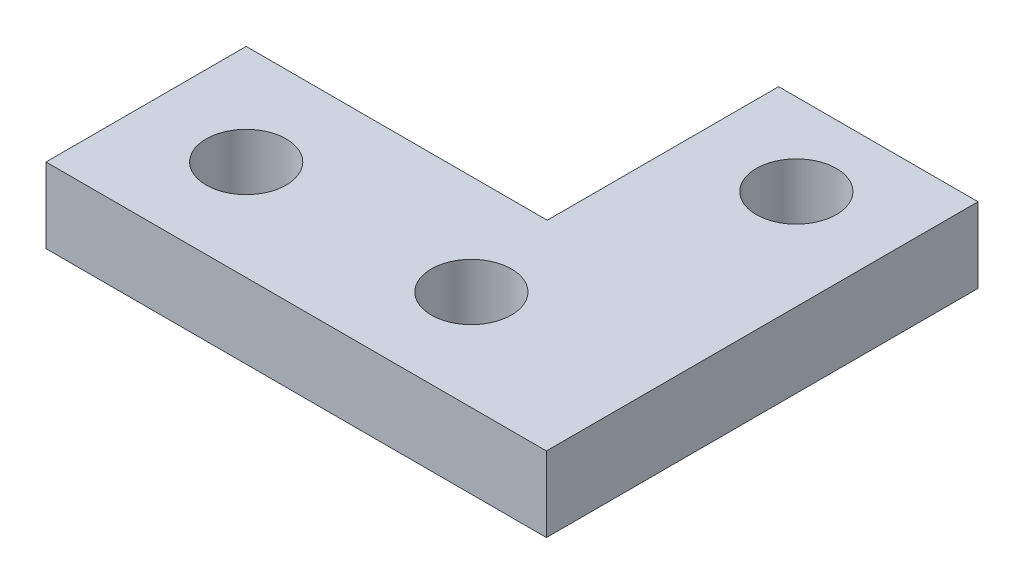
ISO-10303-21;
HEADER;
FILE_DESCRIPTION(('STEP AP214'),'2;1');
FILE_NAME('part.step','',(''),(''),'','','');
FILE_SCHEMA(('AUTOMOTIVE_DESIGN { 1 0 10303 214 1 1 1 1 }'));
ENDSEC;
DATA;
#1=APPLICATION_CONTEXT('core data for automotive mechanical design processes');
#2=APPLICATION_PROTOCOL_DEFINITION('international standard','automotive_design',2000,#1);
#3=PRODUCT_CONTEXT('',#1,'mechanical');
#4=PRODUCT('Part','Part','',(#3));
#5=PRODUCT_RELATED_PRODUCT_CATEGORY('part','',(#4));
#6=PRODUCT_DEFINITION_FORMATION('','',#4);
#7=PRODUCT_DEFINITION_CONTEXT('part definition',#1,'design');
#8=PRODUCT_DEFINITION('design','',#6,#7);
#9=PRODUCT_DEFINITION_SHAPE('','',#8);
#10=(LENGTH_UNIT() NAMED_UNIT(*) SI_UNIT(.MILLI.,.METRE.));
#11=(NAMED_UNIT(*) PLANE_ANGLE_UNIT() SI_UNIT($,.RADIAN.));
#12=(NAMED_UNIT(*) SI_UNIT($,.STERADIAN.) SOLID_ANGLE_UNIT());
#13=UNCERTAINTY_MEASURE_WITH_UNIT(LENGTH_MEASURE(1.E-05),#10,'distance_accuracy_value','');
#14=(GEOMETRIC_REPRESENTATION_CONTEXT(3) GLOBAL_UNCERTAINTY_ASSIGNED_CONTEXT((#13)) GLOBAL_UNIT_ASSIGNED_CONTEXT((#10,
#11,#12)) REPRESENTATION_CONTEXT('',''));
#15=CARTESIAN_POINT('',(0.,0.,0.));
#16=DIRECTION('',(0.,0.,1.));
#17=DIRECTION('',(1.,0.,0.));
#18=AXIS2_PLACEMENT_3D('',#15,#16,#17);
#19=CARTESIAN_POINT('',(0.,3.,0.));
#20=DIRECTION('',(0.,-1.,0.));
#21=DIRECTION('',(0.,0.,-1.));
#22=AXIS2_PLACEMENT_3D('',#19,#20,#21);
#23=PLANE('',#22);
#24=DIRECTION('',(0.,0.,1.));
#25=VECTOR('',#24,1.);
#26=CARTESIAN_POINT('',(0.,3.,0.));
#27=LINE('',#26,#25);
#28=CARTESIAN_POINT('',(0.,3.,-8.));
#29=VERTEX_POINT('',#28);
#30=CARTESIAN_POINT('',(0.,3.,0.));
#31=VERTEX_POINT('',#30);
#32=EDGE_CURVE('E132',#29,#31,#27,.T.);
#33=ORIENTED_EDGE('',*,*,#32,.T.);
#34=DIRECTION('',(1.,0.,0.));
#35=VECTOR('',#34,1.);
#36=CARTESIAN_POINT('',(0.,3.,0.));
#37=LINE('',#36,#35);
#38=CARTESIAN_POINT('',(20.,3.,0.));
#39=VERTEX_POINT('',#38);
#40=EDGE_CURVE('E89',#31,#39,#37,.T.);
#41=ORIENTED_EDGE('',*,*,#40,.T.);
#42=DIRECTION('',(0.,0.,-1.));
#43=VECTOR('',#42,1.);
#44=CARTESIAN_POINT('',(20.,3.,0.));
#45=LINE('',#44,#43);
#46=CARTESIAN_POINT('',(20.,3.,-17.2473887185271));
#47=VERTEX_POINT('',#46);
#48=EDGE_CURVE('E102',#39,#47,#45,.T.);
#49=ORIENTED_EDGE('',*,*,#48,.T.);
#50=DIRECTION('',(-1.,0.,0.));
#51=VECTOR('',#50,1.);
#52=CARTESIAN_POINT('',(12.0321682050819,3.,-17.2473887185271));
#53=LINE('',#52,#51);
#54=CARTESIAN_POINT('',(12.0321682050819,3.,-17.2473887185271));
#55=VERTEX_POINT('',#54);
#56=EDGE_CURVE('E96',#47,#55,#53,.T.);
#57=ORIENTED_EDGE('',*,*,#56,.T.);
#58=DIRECTION('',(0.,0.,1.));
#59=VECTOR('',#58,1.);
#60=CARTESIAN_POINT('',(12.0321682050819,3.,-8.));
#61=LINE('',#60,#59);
#62=CARTESIAN_POINT('',(12.0321682050819,3.,-8.));
#63=VERTEX_POINT('',#62);
#64=EDGE_CURVE('E100',#55,#63,#61,.T.);
#65=ORIENTED_EDGE('',*,*,#64,.T.);
#66=DIRECTION('',(-1.,0.,0.));
#67=VECTOR('',#66,1.);
#68=CARTESIAN_POINT('',(0.,3.,-8.));
#69=LINE('',#68,#67);
#70=EDGE_CURVE('E52',#63,#29,#69,.T.);
#71=ORIENTED_EDGE('',*,*,#70,.T.);
#72=EDGE_LOOP('',(#33,#41,#49,#57,#65,#71));
#73=FACE_BOUND('',#72,.T.);
#74=CARTESIAN_POINT('',(4.,3.,-4.));
#75=DIRECTION('',(0.,1.,0.));
#76=DIRECTION('',(0.,0.,1.));
#77=AXIS2_PLACEMENT_3D('',#74,#75,#76);
#78=CIRCLE('',#77,1.6);
#79=CARTESIAN_POINT('',(4.,3.,-2.4));
#80=VERTEX_POINT('',#79);
#81=EDGE_CURVE('E124',#80,#80,#78,.T.);
#82=ORIENTED_EDGE('',*,*,#81,.F.);
#83=EDGE_LOOP('',(#82));
#84=FACE_BOUND('',#83,.T.);
#85=CARTESIAN_POINT('',(13.,3.,-4.));
#86=DIRECTION('',(0.,1.,0.));
#87=DIRECTION('',(0.,0.,1.));
#88=AXIS2_PLACEMENT_3D('',#85,#86,#87);
#89=CIRCLE('',#88,1.6);
#90=CARTESIAN_POINT('',(13.,3.,-2.4));
#91=VERTEX_POINT('',#90);
#92=EDGE_CURVE('E186',#91,#91,#89,.T.);
#93=ORIENTED_EDGE('',*,*,#92,.F.);
#94=EDGE_LOOP('',(#93));
#95=FACE_BOUND('',#94,.T.);
#96=CARTESIAN_POINT('',(16.0160841025409,3.,-13.9713255483913));
#97=DIRECTION('',(0.,1.,0.));
#98=DIRECTION('',(0.,0.,1.));
#99=AXIS2_PLACEMENT_3D('',#96,#97,#98);
#100=CIRCLE('',#99,1.6);
#101=CARTESIAN_POINT('',(16.0160841025409,3.,-12.3713255483913));
#102=VERTEX_POINT('',#101);
#103=EDGE_CURVE('E177',#102,#102,#100,.T.);
#104=ORIENTED_EDGE('',*,*,#103,.F.);
#105=EDGE_LOOP('',(#104));
#106=FACE_BOUND('',#105,.T.);
#107=ADVANCED_FACE('F35',(#73,#84,#95,#106),#23,.F.);
#108=CARTESIAN_POINT('',(0.,0.,0.));
#109=DIRECTION('',(0.,-1.,0.));
#110=DIRECTION('',(0.,0.,-1.));
#111=AXIS2_PLACEMENT_3D('',#108,#109,#110);
#112=PLANE('',#111);
#113=CARTESIAN_POINT('',(13.,0.,-4.));
#114=DIRECTION('',(0.,1.,0.));
#115=DIRECTION('',(0.,0.,1.));
#116=AXIS2_PLACEMENT_3D('',#113,#114,#115);
#117=CIRCLE('',#116,1.6);
#118=CARTESIAN_POINT('',(13.,0.,-2.4));
#119=VERTEX_POINT('',#118);
#120=EDGE_CURVE('E183',#119,#119,#117,.T.);
#121=ORIENTED_EDGE('',*,*,#120,.T.);
#122=EDGE_LOOP('',(#121));
#123=FACE_BOUND('',#122,.T.);
#124=DIRECTION('',(0.,0.,1.));
#125=VECTOR('',#124,1.);
#126=CARTESIAN_POINT('',(0.,0.,0.));
#127=LINE('',#126,#125);
#128=CARTESIAN_POINT('',(0.,0.,-8.));
#129=VERTEX_POINT('',#128);
#130=CARTESIAN_POINT('',(0.,0.,0.));
#131=VERTEX_POINT('',#130);
#132=EDGE_CURVE('E120',#129,#131,#127,.T.);
#133=ORIENTED_EDGE('',*,*,#132,.F.);
#134=DIRECTION('',(-1.,0.,0.));
#135=VECTOR('',#134,1.);
#136=CARTESIAN_POINT('',(0.,0.,-8.));
#137=LINE('',#136,#135);
#138=CARTESIAN_POINT('',(12.0321682050819,0.,-8.));
#139=VERTEX_POINT('',#138);
#140=EDGE_CURVE('E81',#139,#129,#137,.T.);
#141=ORIENTED_EDGE('',*,*,#140,.F.);
#142=DIRECTION('',(0.,0.,1.));
#143=VECTOR('',#142,1.);
#144=CARTESIAN_POINT('',(12.0321682050819,0.,-8.));
#145=LINE('',#144,#143);
#146=CARTESIAN_POINT('',(12.0321682050819,0.,-17.2473887185271));
#147=VERTEX_POINT('',#146);
#148=EDGE_CURVE('E75',#147,#139,#145,.T.);
#149=ORIENTED_EDGE('',*,*,#148,.F.);
#150=DIRECTION('',(-1.,0.,0.));
#151=VECTOR('',#150,1.);
#152=CARTESIAN_POINT('',(12.0321682050819,0.,-17.2473887185271));
#153=LINE('',#152,#151);
#154=CARTESIAN_POINT('',(20.,0.,-17.2473887185271));
#155=VERTEX_POINT('',#154);
#156=EDGE_CURVE('E110',#155,#147,#153,.T.);
#157=ORIENTED_EDGE('',*,*,#156,.F.);
#158=DIRECTION('',(0.,0.,-1.));
#159=VECTOR('',#158,1.);
#160=CARTESIAN_POINT('',(20.,0.,-17.2473887185271));
#161=LINE('',#160,#159);
#162=CARTESIAN_POINT('',(20.,0.,0.));
#163=VERTEX_POINT('',#162);
#164=EDGE_CURVE('E127',#163,#155,#161,.T.);
#165=ORIENTED_EDGE('',*,*,#164,.F.);
#166=DIRECTION('',(1.,0.,0.));
#167=VECTOR('',#166,1.);
#168=CARTESIAN_POINT('',(0.,0.,0.));
#169=LINE('',#168,#167);
#170=EDGE_CURVE('E123',#131,#163,#169,.T.);
#171=ORIENTED_EDGE('',*,*,#170,.F.);
#172=EDGE_LOOP('',(#133,#141,#149,#157,#165,#171));
#173=FACE_BOUND('',#172,.T.);
#174=CARTESIAN_POINT('',(4.,0.,-4.));
#175=DIRECTION('',(0.,1.,0.));
#176=DIRECTION('',(0.,0.,1.));
#177=AXIS2_PLACEMENT_3D('',#174,#175,#176);
#178=CIRCLE('',#177,1.6);
#179=CARTESIAN_POINT('',(4.,0.,-2.4));
#180=VERTEX_POINT('',#179);
#181=EDGE_CURVE('E189',#180,#180,#178,.T.);
#182=ORIENTED_EDGE('',*,*,#181,.T.);
#183=EDGE_LOOP('',(#182));
#184=FACE_BOUND('',#183,.T.);
#185=CARTESIAN_POINT('',(16.0160841025409,0.,-13.9713255483913));
#186=DIRECTION('',(0.,1.,0.));
#187=DIRECTION('',(0.,0.,1.));
#188=AXIS2_PLACEMENT_3D('',#185,#186,#187);
#189=CIRCLE('',#188,1.6);
#190=CARTESIAN_POINT('',(16.0160841025409,0.,-12.3713255483913));
#191=VERTEX_POINT('',#190);
#192=EDGE_CURVE('E180',#191,#191,#189,.T.);
#193=ORIENTED_EDGE('',*,*,#192,.T.);
#194=EDGE_LOOP('',(#193));
#195=FACE_BOUND('',#194,.T.);
#196=ADVANCED_FACE('F142',(#123,#173,#184,#195),#112,.T.);
#197=CARTESIAN_POINT('',(0.,3.,0.));
#198=DIRECTION('',(1.,0.,0.));
#199=DIRECTION('',(0.,0.,-1.));
#200=AXIS2_PLACEMENT_3D('',#197,#198,#199);
#201=PLANE('',#200);
#202=ORIENTED_EDGE('',*,*,#132,.T.);
#203=DIRECTION('',(0.,-1.,0.));
#204=VECTOR('',#203,1.);
#205=CARTESIAN_POINT('',(0.,3.,0.));
#206=LINE('',#205,#204);
#207=EDGE_CURVE('E11',#31,#131,#206,.T.);
#208=ORIENTED_EDGE('',*,*,#207,.F.);
#209=ORIENTED_EDGE('',*,*,#32,.F.);
#210=DIRECTION('',(0.,-1.,0.));
#211=VECTOR('',#210,1.);
#212=CARTESIAN_POINT('',(0.,3.,-8.));
#213=LINE('',#212,#211);
#214=EDGE_CURVE('E116',#29,#129,#213,.T.);
#215=ORIENTED_EDGE('',*,*,#214,.T.);
#216=EDGE_LOOP('',(#202,#208,#209,#215));
#217=FACE_BOUND('',#216,.T.);
#218=ADVANCED_FACE('F37',(#217),#201,.F.);
#219=CARTESIAN_POINT('',(0.,3.,0.));
#220=DIRECTION('',(0.,0.,-1.));
#221=DIRECTION('',(-1.,0.,0.));
#222=AXIS2_PLACEMENT_3D('',#219,#220,#221);
#223=PLANE('',#222);
#224=ORIENTED_EDGE('',*,*,#170,.T.);
#225=DIRECTION('',(0.,-1.,0.));
#226=VECTOR('',#225,1.);
#227=CARTESIAN_POINT('',(20.,3.,0.));
#228=LINE('',#227,#226);
#229=EDGE_CURVE('E44',#39,#163,#228,.T.);
#230=ORIENTED_EDGE('',*,*,#229,.F.);
#231=ORIENTED_EDGE('',*,*,#40,.F.);
#232=ORIENTED_EDGE('',*,*,#207,.T.);
#233=EDGE_LOOP('',(#224,#230,#231,#232));
#234=FACE_BOUND('',#233,.T.);
#235=ADVANCED_FACE('F138',(#234),#223,.F.);
#236=CARTESIAN_POINT('',(20.,3.,-17.2473887185271));
#237=DIRECTION('',(-1.,0.,0.));
#238=DIRECTION('',(0.,0.,1.));
#239=AXIS2_PLACEMENT_3D('',#236,#237,#238);
#240=PLANE('',#239);
#241=ORIENTED_EDGE('',*,*,#164,.T.);
#242=DIRECTION('',(0.,-1.,0.));
#243=VECTOR('',#242,1.);
#244=CARTESIAN_POINT('',(20.,3.,-17.2473887185271));
#245=LINE('',#244,#243);
#246=EDGE_CURVE('E111',#47,#155,#245,.T.);
#247=ORIENTED_EDGE('',*,*,#246,.F.);
#248=ORIENTED_EDGE('',*,*,#48,.F.);
#249=ORIENTED_EDGE('',*,*,#229,.T.);
#250=EDGE_LOOP('',(#241,#247,#248,#249));
#251=FACE_BOUND('',#250,.T.);
#252=ADVANCED_FACE('F137',(#251),#240,.F.);
#253=CARTESIAN_POINT('',(12.0321682050819,3.,-17.2473887185271));
#254=DIRECTION('',(0.,0.,1.));
#255=DIRECTION('',(1.,0.,0.));
#256=AXIS2_PLACEMENT_3D('',#253,#254,#255);
#257=PLANE('',#256);
#258=ORIENTED_EDGE('',*,*,#156,.T.);
#259=DIRECTION('',(0.,-1.,0.));
#260=VECTOR('',#259,1.);
#261=CARTESIAN_POINT('',(12.0321682050819,3.,-17.2473887185271));
#262=LINE('',#261,#260);
#263=EDGE_CURVE('E107',#55,#147,#262,.T.);
#264=ORIENTED_EDGE('',*,*,#263,.F.);
#265=ORIENTED_EDGE('',*,*,#56,.F.);
#266=ORIENTED_EDGE('',*,*,#246,.T.);
#267=EDGE_LOOP('',(#258,#264,#265,#266));
#268=FACE_BOUND('',#267,.T.);
#269=ADVANCED_FACE('F108',(#268),#257,.F.);
#270=CARTESIAN_POINT('',(12.0321682050819,3.,-8.));
#271=DIRECTION('',(1.,0.,0.));
#272=DIRECTION('',(0.,0.,-1.));
#273=AXIS2_PLACEMENT_3D('',#270,#271,#272);
#274=PLANE('',#273);
#275=ORIENTED_EDGE('',*,*,#148,.T.);
#276=DIRECTION('',(0.,-1.,0.));
#277=VECTOR('',#276,1.);
#278=CARTESIAN_POINT('',(12.0321682050819,3.,-8.));
#279=LINE('',#278,#277);
#280=EDGE_CURVE('E112',#63,#139,#279,.T.);
#281=ORIENTED_EDGE('',*,*,#280,.F.);
#282=ORIENTED_EDGE('',*,*,#64,.F.);
#283=ORIENTED_EDGE('',*,*,#263,.T.);
#284=EDGE_LOOP('',(#275,#281,#282,#283));
#285=FACE_BOUND('',#284,.T.);
#286=ADVANCED_FACE('F114',(#285),#274,.F.);
#287=CARTESIAN_POINT('',(0.,3.,-8.));
#288=DIRECTION('',(0.,0.,1.));
#289=DIRECTION('',(1.,0.,0.));
#290=AXIS2_PLACEMENT_3D('',#287,#288,#289);
#291=PLANE('',#290);
#292=ORIENTED_EDGE('',*,*,#140,.T.);
#293=ORIENTED_EDGE('',*,*,#214,.F.);
#294=ORIENTED_EDGE('',*,*,#70,.F.);
#295=ORIENTED_EDGE('',*,*,#280,.T.);
#296=EDGE_LOOP('',(#292,#293,#294,#295));
#297=FACE_BOUND('',#296,.T.);
#298=ADVANCED_FACE('F146',(#297),#291,.F.);
#299=CARTESIAN_POINT('',(4.,3.,-4.));
#300=DIRECTION('',(0.,-1.,0.));
#301=DIRECTION('',(0.,0.,-1.));
#302=AXIS2_PLACEMENT_3D('',#299,#300,#301);
#303=CYLINDRICAL_SURFACE('',#302,1.6);
#304=ORIENTED_EDGE('',*,*,#81,.T.);
#305=EDGE_LOOP('',(#304));
#306=FACE_BOUND('',#305,.T.);
#307=ORIENTED_EDGE('',*,*,#181,.F.);
#308=EDGE_LOOP('',(#307));
#309=FACE_BOUND('',#308,.T.);
#310=ADVANCED_FACE('F148',(#306,#309),#303,.F.);
#311=CARTESIAN_POINT('',(13.,3.,-4.));
#312=DIRECTION('',(0.,-1.,0.));
#313=DIRECTION('',(0.,0.,-1.));
#314=AXIS2_PLACEMENT_3D('',#311,#312,#313);
#315=CYLINDRICAL_SURFACE('',#314,1.6);
#316=ORIENTED_EDGE('',*,*,#92,.T.);
#317=EDGE_LOOP('',(#316));
#318=FACE_BOUND('',#317,.T.);
#319=ORIENTED_EDGE('',*,*,#120,.F.);
#320=EDGE_LOOP('',(#319));
#321=FACE_BOUND('',#320,.T.);
#322=ADVANCED_FACE('F154',(#318,#321),#315,.F.);
#323=CARTESIAN_POINT('',(16.0160841025409,3.,-13.9713255483913));
#324=DIRECTION('',(0.,-1.,0.));
#325=DIRECTION('',(0.,0.,-1.));
#326=AXIS2_PLACEMENT_3D('',#323,#324,#325);
#327=CYLINDRICAL_SURFACE('',#326,1.6);
#328=ORIENTED_EDGE('',*,*,#103,.T.);
#329=EDGE_LOOP('',(#328));
#330=FACE_BOUND('',#329,.T.);
#331=ORIENTED_EDGE('',*,*,#192,.F.);
#332=EDGE_LOOP('',(#331));
#333=FACE_BOUND('',#332,.T.);
#334=ADVANCED_FACE('F168',(#330,#333),#327,.F.);
#335=CLOSED_SHELL('',(#107,#196,#218,#235,#252,#269,#286,#298,#310,#322,#334));
#336=MANIFOLD_SOLID_BREP('B2',#335);
#337=ADVANCED_BREP_SHAPE_REPRESENTATION('',(#18,#336),#14);
#338=SHAPE_DEFINITION_REPRESENTATION(#9,#337);
ENDSEC;
END-ISO-10303-21;
